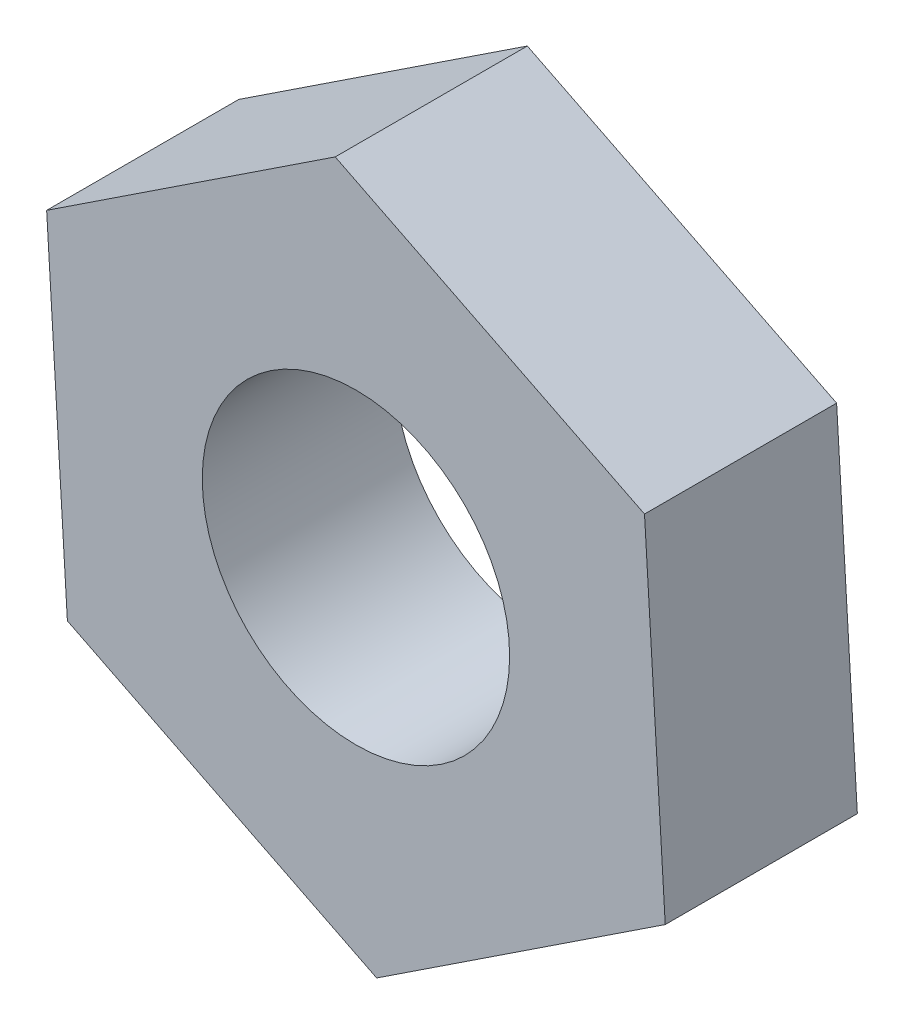
ISO-10303-21;
HEADER;
FILE_DESCRIPTION(('STEP AP214'),'2;1');
FILE_NAME('part.step','',(''),(''),'','','');
FILE_SCHEMA(('AUTOMOTIVE_DESIGN { 1 0 10303 214 1 1 1 1 }'));
ENDSEC;
DATA;
#1=APPLICATION_CONTEXT('core data for automotive mechanical design processes');
#2=APPLICATION_PROTOCOL_DEFINITION('international standard','automotive_design',2000,#1);
#3=PRODUCT_CONTEXT('',#1,'mechanical');
#4=PRODUCT('Part','Part','',(#3));
#5=PRODUCT_RELATED_PRODUCT_CATEGORY('part','',(#4));
#6=PRODUCT_DEFINITION_FORMATION('','',#4);
#7=PRODUCT_DEFINITION_CONTEXT('part definition',#1,'design');
#8=PRODUCT_DEFINITION('design','',#6,#7);
#9=PRODUCT_DEFINITION_SHAPE('','',#8);
#10=(LENGTH_UNIT() NAMED_UNIT(*) SI_UNIT(.MILLI.,.METRE.));
#11=(NAMED_UNIT(*) PLANE_ANGLE_UNIT() SI_UNIT($,.RADIAN.));
#12=(NAMED_UNIT(*) SI_UNIT($,.STERADIAN.) SOLID_ANGLE_UNIT());
#13=UNCERTAINTY_MEASURE_WITH_UNIT(LENGTH_MEASURE(1.E-05),#10,'distance_accuracy_value','');
#14=(GEOMETRIC_REPRESENTATION_CONTEXT(3) GLOBAL_UNCERTAINTY_ASSIGNED_CONTEXT((#13)) GLOBAL_UNIT_ASSIGNED_CONTEXT((#10,
#11,#12)) REPRESENTATION_CONTEXT('',''));
#15=CARTESIAN_POINT('',(0.,0.,0.));
#16=DIRECTION('',(0.,0.,1.));
#17=DIRECTION('',(1.,0.,0.));
#18=AXIS2_PLACEMENT_3D('',#15,#16,#17);
#19=CARTESIAN_POINT('',(0.,0.,5.));
#20=DIRECTION('',(0.,0.,1.));
#21=DIRECTION('',(1.,0.,0.));
#22=AXIS2_PLACEMENT_3D('',#19,#20,#21);
#23=PLANE('',#22);
#24=DIRECTION('',(-0.894448390647223,0.447171193692742,0.));
#25=VECTOR('',#24,1.);
#26=CARTESIAN_POINT('',(7.51037228011925,4.95926488645408,5.));
#27=LINE('',#26,#25);
#28=CARTESIAN_POINT('',(7.51037228011925,4.95926488645408,5.));
#29=VERTEX_POINT('',#28);
#30=CARTESIAN_POINT('',(-0.539663235705763,8.98380562968876,5.));
#31=VERTEX_POINT('',#30);
#32=EDGE_CURVE('E129',#29,#31,#27,.T.);
#33=ORIENTED_EDGE('',*,*,#32,.T.);
#34=DIRECTION('',(-0.834485808902139,-0.551029431828232,0.));
#35=VECTOR('',#34,1.);
#36=CARTESIAN_POINT('',(-0.539663235705763,8.98380562968876,5.));
#37=LINE('',#36,#35);
#38=CARTESIAN_POINT('',(-8.05003551582501,4.02454074323468,5.));
#39=VERTEX_POINT('',#38);
#40=EDGE_CURVE('E87',#31,#39,#37,.T.);
#41=ORIENTED_EDGE('',*,*,#40,.T.);
#42=DIRECTION('',(0.0599625817450847,-0.998200625520974,0.));
#43=VECTOR('',#42,1.);
#44=CARTESIAN_POINT('',(-8.05003551582501,4.02454074323468,5.));
#45=LINE('',#44,#43);
#46=CARTESIAN_POINT('',(-7.51037228011925,-4.95926488645408,5.));
#47=VERTEX_POINT('',#46);
#48=EDGE_CURVE('E100',#39,#47,#45,.T.);
#49=ORIENTED_EDGE('',*,*,#48,.T.);
#50=DIRECTION('',(0.894448390647223,-0.447171193692742,0.));
#51=VECTOR('',#50,1.);
#52=CARTESIAN_POINT('',(-7.51037228011925,-4.95926488645408,5.));
#53=LINE('',#52,#51);
#54=CARTESIAN_POINT('',(0.539663235705767,-8.98380562968877,5.));
#55=VERTEX_POINT('',#54);
#56=EDGE_CURVE('E94',#47,#55,#53,.T.);
#57=ORIENTED_EDGE('',*,*,#56,.T.);
#58=DIRECTION('',(0.834485808902138,0.551029431828232,0.));
#59=VECTOR('',#58,1.);
#60=CARTESIAN_POINT('',(0.539663235705767,-8.98380562968877,5.));
#61=LINE('',#60,#59);
#62=CARTESIAN_POINT('',(8.05003551582501,-4.02454074323469,5.));
#63=VERTEX_POINT('',#62);
#64=EDGE_CURVE('E98',#55,#63,#61,.T.);
#65=ORIENTED_EDGE('',*,*,#64,.T.);
#66=DIRECTION('',(-0.0599625817450846,0.998200625520974,0.));
#67=VECTOR('',#66,1.);
#68=CARTESIAN_POINT('',(8.05003551582501,-4.02454074323469,5.));
#69=LINE('',#68,#67);
#70=EDGE_CURVE('E50',#63,#29,#69,.T.);
#71=ORIENTED_EDGE('',*,*,#70,.T.);
#72=EDGE_LOOP('',(#33,#41,#49,#57,#65,#71));
#73=FACE_BOUND('',#72,.T.);
#74=CARTESIAN_POINT('',(0.,0.,5.));
#75=DIRECTION('',(0.,0.,1.));
#76=DIRECTION('',(1.,0.,0.));
#77=AXIS2_PLACEMENT_3D('',#74,#75,#76);
#78=CIRCLE('',#77,4.);
#79=CARTESIAN_POINT('',(4.,0.,5.));
#80=VERTEX_POINT('',#79);
#81=EDGE_CURVE('E122',#80,#80,#78,.T.);
#82=ORIENTED_EDGE('',*,*,#81,.F.);
#83=EDGE_LOOP('',(#82));
#84=FACE_BOUND('',#83,.T.);
#85=ADVANCED_FACE('F33',(#73,#84),#23,.T.);
#86=CARTESIAN_POINT('',(0.,0.,0.));
#87=DIRECTION('',(0.,0.,1.));
#88=DIRECTION('',(1.,0.,0.));
#89=AXIS2_PLACEMENT_3D('',#86,#87,#88);
#90=PLANE('',#89);
#91=DIRECTION('',(-0.894448390647223,0.447171193692742,0.));
#92=VECTOR('',#91,1.);
#93=CARTESIAN_POINT('',(7.51037228011925,4.95926488645408,0.));
#94=LINE('',#93,#92);
#95=CARTESIAN_POINT('',(7.51037228011925,4.95926488645408,0.));
#96=VERTEX_POINT('',#95);
#97=CARTESIAN_POINT('',(-0.539663235705763,8.98380562968876,0.));
#98=VERTEX_POINT('',#97);
#99=EDGE_CURVE('E118',#96,#98,#94,.T.);
#100=ORIENTED_EDGE('',*,*,#99,.F.);
#101=DIRECTION('',(-0.0599625817450846,0.998200625520974,0.));
#102=VECTOR('',#101,1.);
#103=CARTESIAN_POINT('',(8.05003551582501,-4.02454074323469,0.));
#104=LINE('',#103,#102);
#105=CARTESIAN_POINT('',(8.05003551582501,-4.02454074323469,0.));
#106=VERTEX_POINT('',#105);
#107=EDGE_CURVE('E79',#106,#96,#104,.T.);
#108=ORIENTED_EDGE('',*,*,#107,.F.);
#109=DIRECTION('',(0.834485808902138,0.551029431828232,0.));
#110=VECTOR('',#109,1.);
#111=CARTESIAN_POINT('',(0.539663235705767,-8.98380562968877,0.));
#112=LINE('',#111,#110);
#113=CARTESIAN_POINT('',(0.539663235705767,-8.98380562968877,0.));
#114=VERTEX_POINT('',#113);
#115=EDGE_CURVE('E73',#114,#106,#112,.T.);
#116=ORIENTED_EDGE('',*,*,#115,.F.);
#117=DIRECTION('',(0.894448390647223,-0.447171193692742,0.));
#118=VECTOR('',#117,1.);
#119=CARTESIAN_POINT('',(-7.51037228011925,-4.95926488645408,0.));
#120=LINE('',#119,#118);
#121=CARTESIAN_POINT('',(-7.51037228011925,-4.95926488645408,0.));
#122=VERTEX_POINT('',#121);
#123=EDGE_CURVE('E108',#122,#114,#120,.T.);
#124=ORIENTED_EDGE('',*,*,#123,.F.);
#125=DIRECTION('',(0.0599625817450847,-0.998200625520974,0.));
#126=VECTOR('',#125,1.);
#127=CARTESIAN_POINT('',(-8.05003551582501,4.02454074323468,0.));
#128=LINE('',#127,#126);
#129=CARTESIAN_POINT('',(-8.05003551582501,4.02454074323468,0.));
#130=VERTEX_POINT('',#129);
#131=EDGE_CURVE('E124',#130,#122,#128,.T.);
#132=ORIENTED_EDGE('',*,*,#131,.F.);
#133=DIRECTION('',(-0.834485808902139,-0.551029431828232,0.));
#134=VECTOR('',#133,1.);
#135=CARTESIAN_POINT('',(-0.539663235705763,8.98380562968876,0.));
#136=LINE('',#135,#134);
#137=EDGE_CURVE('E121',#98,#130,#136,.T.);
#138=ORIENTED_EDGE('',*,*,#137,.F.);
#139=EDGE_LOOP('',(#100,#108,#116,#124,#132,#138));
#140=FACE_BOUND('',#139,.T.);
#141=CARTESIAN_POINT('',(0.,0.,0.));
#142=DIRECTION('',(0.,0.,1.));
#143=DIRECTION('',(1.,0.,0.));
#144=AXIS2_PLACEMENT_3D('',#141,#142,#143);
#145=CIRCLE('',#144,4.);
#146=CARTESIAN_POINT('',(4.,0.,0.));
#147=VERTEX_POINT('',#146);
#148=EDGE_CURVE('E222',#147,#147,#145,.T.);
#149=ORIENTED_EDGE('',*,*,#148,.T.);
#150=EDGE_LOOP('',(#149));
#151=FACE_BOUND('',#150,.T.);
#152=ADVANCED_FACE('F138',(#140,#151),#90,.F.);
#153=CARTESIAN_POINT('',(7.51037228011925,4.95926488645408,5.));
#154=DIRECTION('',(-0.447171193692742,-0.894448390647223,0.));
#155=DIRECTION('',(0.894448390647223,-0.447171193692742,0.));
#156=AXIS2_PLACEMENT_3D('',#153,#154,#155);
#157=PLANE('',#156);
#158=ORIENTED_EDGE('',*,*,#99,.T.);
#159=DIRECTION('',(0.,0.,-1.));
#160=VECTOR('',#159,1.);
#161=CARTESIAN_POINT('',(-0.539663235705763,8.98380562968876,5.));
#162=LINE('',#161,#160);
#163=EDGE_CURVE('E11',#31,#98,#162,.T.);
#164=ORIENTED_EDGE('',*,*,#163,.F.);
#165=ORIENTED_EDGE('',*,*,#32,.F.);
#166=DIRECTION('',(0.,0.,-1.));
#167=VECTOR('',#166,1.);
#168=CARTESIAN_POINT('',(7.51037228011925,4.95926488645408,5.));
#169=LINE('',#168,#167);
#170=EDGE_CURVE('E114',#29,#96,#169,.T.);
#171=ORIENTED_EDGE('',*,*,#170,.T.);
#172=EDGE_LOOP('',(#158,#164,#165,#171));
#173=FACE_BOUND('',#172,.T.);
#174=ADVANCED_FACE('F35',(#173),#157,.F.);
#175=CARTESIAN_POINT('',(-0.539663235705763,8.98380562968876,5.));
#176=DIRECTION('',(0.551029431828231,-0.834485808902138,0.));
#177=DIRECTION('',(0.834485808902139,0.551029431828232,0.));
#178=AXIS2_PLACEMENT_3D('',#175,#176,#177);
#179=PLANE('',#178);
#180=ORIENTED_EDGE('',*,*,#137,.T.);
#181=DIRECTION('',(0.,0.,-1.));
#182=VECTOR('',#181,1.);
#183=CARTESIAN_POINT('',(-8.05003551582501,4.02454074323468,5.));
#184=LINE('',#183,#182);
#185=EDGE_CURVE('E42',#39,#130,#184,.T.);
#186=ORIENTED_EDGE('',*,*,#185,.F.);
#187=ORIENTED_EDGE('',*,*,#40,.F.);
#188=ORIENTED_EDGE('',*,*,#163,.T.);
#189=EDGE_LOOP('',(#180,#186,#187,#188));
#190=FACE_BOUND('',#189,.T.);
#191=ADVANCED_FACE('F163',(#190),#179,.F.);
#192=CARTESIAN_POINT('',(-8.05003551582501,4.02454074323468,5.));
#193=DIRECTION('',(0.998200625520974,0.0599625817450847,0.));
#194=DIRECTION('',(-0.0599625817450847,0.998200625520974,0.));
#195=AXIS2_PLACEMENT_3D('',#192,#193,#194);
#196=PLANE('',#195);
#197=ORIENTED_EDGE('',*,*,#131,.T.);
#198=DIRECTION('',(0.,0.,-1.));
#199=VECTOR('',#198,1.);
#200=CARTESIAN_POINT('',(-7.51037228011925,-4.95926488645408,5.));
#201=LINE('',#200,#199);
#202=EDGE_CURVE('E109',#47,#122,#201,.T.);
#203=ORIENTED_EDGE('',*,*,#202,.F.);
#204=ORIENTED_EDGE('',*,*,#48,.F.);
#205=ORIENTED_EDGE('',*,*,#185,.T.);
#206=EDGE_LOOP('',(#197,#203,#204,#205));
#207=FACE_BOUND('',#206,.T.);
#208=ADVANCED_FACE('F135',(#207),#196,.F.);
#209=CARTESIAN_POINT('',(-7.51037228011925,-4.95926488645408,5.));
#210=DIRECTION('',(0.447171193692742,0.894448390647223,0.));
#211=DIRECTION('',(-0.894448390647223,0.447171193692742,0.));
#212=AXIS2_PLACEMENT_3D('',#209,#210,#211);
#213=PLANE('',#212);
#214=ORIENTED_EDGE('',*,*,#123,.T.);
#215=DIRECTION('',(0.,0.,-1.));
#216=VECTOR('',#215,1.);
#217=CARTESIAN_POINT('',(0.539663235705767,-8.98380562968877,5.));
#218=LINE('',#217,#216);
#219=EDGE_CURVE('E105',#55,#114,#218,.T.);
#220=ORIENTED_EDGE('',*,*,#219,.F.);
#221=ORIENTED_EDGE('',*,*,#56,.F.);
#222=ORIENTED_EDGE('',*,*,#202,.T.);
#223=EDGE_LOOP('',(#214,#220,#221,#222));
#224=FACE_BOUND('',#223,.T.);
#225=ADVANCED_FACE('F106',(#224),#213,.F.);
#226=CARTESIAN_POINT('',(0.539663235705767,-8.98380562968877,5.));
#227=DIRECTION('',(-0.551029431828232,0.834485808902138,0.));
#228=DIRECTION('',(-0.834485808902138,-0.551029431828232,0.));
#229=AXIS2_PLACEMENT_3D('',#226,#227,#228);
#230=PLANE('',#229);
#231=ORIENTED_EDGE('',*,*,#115,.T.);
#232=DIRECTION('',(0.,0.,-1.));
#233=VECTOR('',#232,1.);
#234=CARTESIAN_POINT('',(8.05003551582501,-4.02454074323469,5.));
#235=LINE('',#234,#233);
#236=EDGE_CURVE('E110',#63,#106,#235,.T.);
#237=ORIENTED_EDGE('',*,*,#236,.F.);
#238=ORIENTED_EDGE('',*,*,#64,.F.);
#239=ORIENTED_EDGE('',*,*,#219,.T.);
#240=EDGE_LOOP('',(#231,#237,#238,#239));
#241=FACE_BOUND('',#240,.T.);
#242=ADVANCED_FACE('F112',(#241),#230,.F.);
#243=CARTESIAN_POINT('',(8.05003551582501,-4.02454074323469,5.));
#244=DIRECTION('',(-0.998200625520974,-0.0599625817450846,0.));
#245=DIRECTION('',(0.0599625817450846,-0.998200625520974,0.));
#246=AXIS2_PLACEMENT_3D('',#243,#244,#245);
#247=PLANE('',#246);
#248=ORIENTED_EDGE('',*,*,#107,.T.);
#249=ORIENTED_EDGE('',*,*,#170,.F.);
#250=ORIENTED_EDGE('',*,*,#70,.F.);
#251=ORIENTED_EDGE('',*,*,#236,.T.);
#252=EDGE_LOOP('',(#248,#249,#250,#251));
#253=FACE_BOUND('',#252,.T.);
#254=ADVANCED_FACE('F143',(#253),#247,.F.);
#255=CARTESIAN_POINT('',(0.,0.,5.));
#256=DIRECTION('',(0.,0.,-1.));
#257=DIRECTION('',(-1.,0.,0.));
#258=AXIS2_PLACEMENT_3D('',#255,#256,#257);
#259=CYLINDRICAL_SURFACE('',#258,4.);
#260=ORIENTED_EDGE('',*,*,#81,.T.);
#261=EDGE_LOOP('',(#260));
#262=FACE_BOUND('',#261,.T.);
#263=ORIENTED_EDGE('',*,*,#148,.F.);
#264=EDGE_LOOP('',(#263));
#265=FACE_BOUND('',#264,.T.);
#266=ADVANCED_FACE('F145',(#262,#265),#259,.F.);
#267=CLOSED_SHELL('',(#85,#152,#174,#191,#208,#225,#242,#254,#266));
#268=MANIFOLD_SOLID_BREP('B2',#267);
#269=ADVANCED_BREP_SHAPE_REPRESENTATION('',(#18,#268),#14);
#270=SHAPE_DEFINITION_REPRESENTATION(#9,#269);
ENDSEC;
END-ISO-10303-21;
